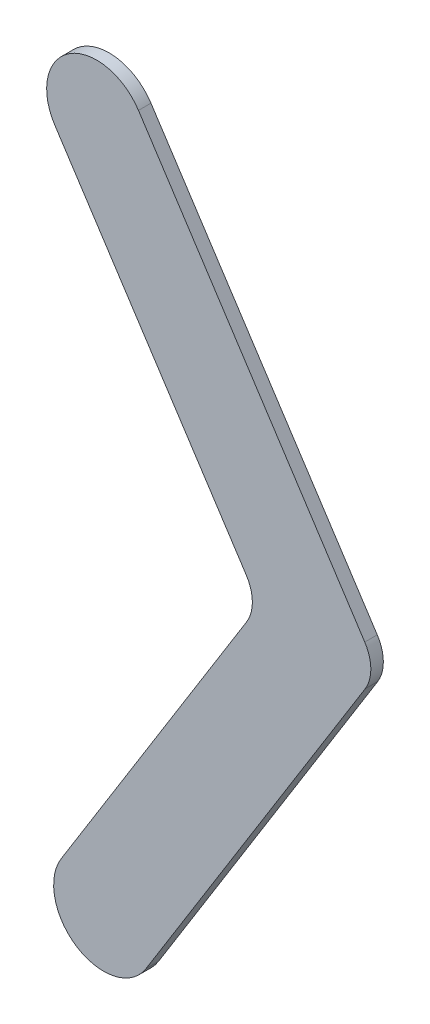
ISO-10303-21;
HEADER;
FILE_DESCRIPTION(('STEP AP214'),'2;1');
FILE_NAME('part.step','',(''),(''),'','','');
FILE_SCHEMA(('AUTOMOTIVE_DESIGN { 1 0 10303 214 1 1 1 1 }'));
ENDSEC;
DATA;
#1=APPLICATION_CONTEXT('core data for automotive mechanical design processes');
#2=APPLICATION_PROTOCOL_DEFINITION('international standard','automotive_design',2000,#1);
#3=PRODUCT_CONTEXT('',#1,'mechanical');
#4=PRODUCT('Part','Part','',(#3));
#5=PRODUCT_RELATED_PRODUCT_CATEGORY('part','',(#4));
#6=PRODUCT_DEFINITION_FORMATION('','',#4);
#7=PRODUCT_DEFINITION_CONTEXT('part definition',#1,'design');
#8=PRODUCT_DEFINITION('design','',#6,#7);
#9=PRODUCT_DEFINITION_SHAPE('','',#8);
#10=(LENGTH_UNIT() NAMED_UNIT(*) SI_UNIT(.MILLI.,.METRE.));
#11=(NAMED_UNIT(*) PLANE_ANGLE_UNIT() SI_UNIT($,.RADIAN.));
#12=(NAMED_UNIT(*) SI_UNIT($,.STERADIAN.) SOLID_ANGLE_UNIT());
#13=UNCERTAINTY_MEASURE_WITH_UNIT(LENGTH_MEASURE(1.E-05),#10,'distance_accuracy_value','');
#14=(GEOMETRIC_REPRESENTATION_CONTEXT(3) GLOBAL_UNCERTAINTY_ASSIGNED_CONTEXT((#13)) GLOBAL_UNIT_ASSIGNED_CONTEXT((#10,
#11,#12)) REPRESENTATION_CONTEXT('',''));
#15=CARTESIAN_POINT('',(0.,0.,0.));
#16=DIRECTION('',(0.,0.,1.));
#17=DIRECTION('',(1.,0.,0.));
#18=AXIS2_PLACEMENT_3D('',#15,#16,#17);
#19=CARTESIAN_POINT('',(0.,0.,1.));
#20=DIRECTION('',(0.837859454186145,0.545886009191384,0.));
#21=DIRECTION('',(-0.545886009191384,0.837859454186145,0.));
#22=AXIS2_PLACEMENT_3D('',#19,#20,#21);
#23=PLANE('',#22);
#24=DIRECTION('',(0.545886009191384,-0.837859454186145,0.));
#25=VECTOR('',#24,1.);
#26=CARTESIAN_POINT('',(0.,0.,0.));
#27=LINE('',#26,#25);
#28=CARTESIAN_POINT('',(-16.3765802757415,25.1357836255843,0.));
#29=VERTEX_POINT('',#28);
#30=CARTESIAN_POINT('',(-1.04330322674015,1.60132602299517,0.));
#31=VERTEX_POINT('',#30);
#32=EDGE_CURVE('E147',#29,#31,#27,.T.);
#33=ORIENTED_EDGE('',*,*,#32,.T.);
#34=DIRECTION('',(0.,0.,-1.));
#35=VECTOR('',#34,1.);
#36=CARTESIAN_POINT('',(-1.04330322674015,1.60132602299517,1.));
#37=LINE('',#36,#35);
#38=CARTESIAN_POINT('',(-1.04330322674015,1.60132602299517,1.));
#39=VERTEX_POINT('',#38);
#40=EDGE_CURVE('E65',#31,#39,#37,.F.);
#41=ORIENTED_EDGE('',*,*,#40,.T.);
#42=DIRECTION('',(0.545886009191384,-0.837859454186145,0.));
#43=VECTOR('',#42,1.);
#44=CARTESIAN_POINT('',(0.,0.,1.));
#45=LINE('',#44,#43);
#46=CARTESIAN_POINT('',(-16.3765802757415,25.1357836255843,1.));
#47=VERTEX_POINT('',#46);
#48=EDGE_CURVE('E117',#47,#39,#45,.T.);
#49=ORIENTED_EDGE('',*,*,#48,.F.);
#50=DIRECTION('',(0.,0.,-1.));
#51=VECTOR('',#50,1.);
#52=CARTESIAN_POINT('',(-16.3765802757415,25.1357836255843,1.));
#53=LINE('',#52,#51);
#54=EDGE_CURVE('E146',#47,#29,#53,.T.);
#55=ORIENTED_EDGE('',*,*,#54,.T.);
#56=EDGE_LOOP('',(#33,#41,#49,#55));
#57=FACE_BOUND('',#56,.T.);
#58=ADVANCED_FACE('F43',(#57),#23,.F.);
#59=CARTESIAN_POINT('',(0.,0.,1.));
#60=DIRECTION('',(0.848835447075673,-0.528657151458147,0.));
#61=DIRECTION('',(0.528657151458147,0.848835447075673,0.));
#62=AXIS2_PLACEMENT_3D('',#59,#60,#61);
#63=PLANE('',#62);
#64=DIRECTION('',(-0.528657151458147,-0.848835447075673,0.));
#65=VECTOR('',#64,1.);
#66=CARTESIAN_POINT('',(0.,0.,1.));
#67=LINE('',#66,#65);
#68=CARTESIAN_POINT('',(-1.01037524807156,-1.62230345895343,1.));
#69=VERTEX_POINT('',#68);
#70=CARTESIAN_POINT('',(-15.8597145437444,-25.4650634122702,1.));
#71=VERTEX_POINT('',#70);
#72=EDGE_CURVE('E106',#69,#71,#67,.T.);
#73=ORIENTED_EDGE('',*,*,#72,.F.);
#74=DIRECTION('',(0.,0.,-1.));
#75=VECTOR('',#74,1.);
#76=CARTESIAN_POINT('',(-1.01037524807156,-1.62230345895343,0.));
#77=LINE('',#76,#75);
#78=CARTESIAN_POINT('',(-1.01037524807156,-1.62230345895343,0.));
#79=VERTEX_POINT('',#78);
#80=EDGE_CURVE('E186',#69,#79,#77,.T.);
#81=ORIENTED_EDGE('',*,*,#80,.T.);
#82=DIRECTION('',(-0.528657151458147,-0.848835447075673,0.));
#83=VECTOR('',#82,1.);
#84=CARTESIAN_POINT('',(0.,0.,0.));
#85=LINE('',#84,#83);
#86=CARTESIAN_POINT('',(-15.8597145437444,-25.4650634122702,0.));
#87=VERTEX_POINT('',#86);
#88=EDGE_CURVE('E123',#79,#87,#85,.T.);
#89=ORIENTED_EDGE('',*,*,#88,.T.);
#90=DIRECTION('',(0.,0.,-1.));
#91=VECTOR('',#90,1.);
#92=CARTESIAN_POINT('',(-15.8597145437444,-25.4650634122702,1.));
#93=LINE('',#92,#91);
#94=EDGE_CURVE('E120',#71,#87,#93,.T.);
#95=ORIENTED_EDGE('',*,*,#94,.F.);
#96=EDGE_LOOP('',(#73,#81,#89,#95));
#97=FACE_BOUND('',#96,.T.);
#98=ADVANCED_FACE('F121',(#97),#63,.F.);
#99=CARTESIAN_POINT('',(-12.4643727554417,-27.5796920181028,1.));
#100=DIRECTION('',(0.,0.,-1.));
#101=DIRECTION('',(-1.,0.,0.));
#102=AXIS2_PLACEMENT_3D('',#99,#100,#101);
#103=CYLINDRICAL_SURFACE('',#102,4.);
#104=CARTESIAN_POINT('',(-12.4643727554417,-27.5796920181028,0.));
#105=DIRECTION('',(0.,0.,1.));
#106=DIRECTION('',(1.,0.,0.));
#107=AXIS2_PLACEMENT_3D('',#104,#105,#106);
#108=CIRCLE('',#107,4.);
#109=CARTESIAN_POINT('',(-9.06903096713901,-29.6943206239354,0.));
#110=VERTEX_POINT('',#109);
#111=EDGE_CURVE('E152',#87,#110,#108,.T.);
#112=ORIENTED_EDGE('',*,*,#111,.T.);
#113=DIRECTION('',(0.,0.,-1.));
#114=VECTOR('',#113,1.);
#115=CARTESIAN_POINT('',(-9.06903096713901,-29.6943206239354,1.));
#116=LINE('',#115,#114);
#117=CARTESIAN_POINT('',(-9.06903096713901,-29.6943206239354,1.));
#118=VERTEX_POINT('',#117);
#119=EDGE_CURVE('E128',#118,#110,#116,.T.);
#120=ORIENTED_EDGE('',*,*,#119,.F.);
#121=CARTESIAN_POINT('',(-12.4643727554417,-27.5796920181028,1.));
#122=DIRECTION('',(0.,0.,1.));
#123=DIRECTION('',(1.,0.,0.));
#124=AXIS2_PLACEMENT_3D('',#121,#122,#123);
#125=CIRCLE('',#124,4.);
#126=EDGE_CURVE('E111',#71,#118,#125,.T.);
#127=ORIENTED_EDGE('',*,*,#126,.F.);
#128=ORIENTED_EDGE('',*,*,#94,.T.);
#129=EDGE_LOOP('',(#112,#120,#127,#128));
#130=FACE_BOUND('',#129,.T.);
#131=ADVANCED_FACE('F130',(#130),#103,.T.);
#132=CARTESIAN_POINT('',(9.48501757146288,0.0968853455439621,1.));
#133=DIRECTION('',(-0.848835447075673,0.528657151458147,0.));
#134=DIRECTION('',(-0.528657151458147,-0.848835447075673,0.));
#135=AXIS2_PLACEMENT_3D('',#132,#133,#134);
#136=PLANE('',#135);
#137=DIRECTION('',(0.528657151458147,0.848835447075673,0.));
#138=VECTOR('',#137,1.);
#139=CARTESIAN_POINT('',(9.48501757146288,0.0968853455439621,0.));
#140=LINE('',#139,#138);
#141=CARTESIAN_POINT('',(8.47464232339132,-1.52541811340946,0.));
#142=VERTEX_POINT('',#141);
#143=EDGE_CURVE('E155',#110,#142,#140,.T.);
#144=ORIENTED_EDGE('',*,*,#143,.T.);
#145=DIRECTION('',(0.,0.,-1.));
#146=VECTOR('',#145,1.);
#147=CARTESIAN_POINT('',(8.47464232339132,-1.52541811340946,1.));
#148=LINE('',#147,#146);
#149=CARTESIAN_POINT('',(8.47464232339132,-1.52541811340946,1.));
#150=VERTEX_POINT('',#149);
#151=EDGE_CURVE('E180',#142,#150,#148,.F.);
#152=ORIENTED_EDGE('',*,*,#151,.T.);
#153=DIRECTION('',(0.528657151458147,0.848835447075673,0.));
#154=VECTOR('',#153,1.);
#155=CARTESIAN_POINT('',(9.48501757146288,0.0968853455439621,1.));
#156=LINE('',#155,#154);
#157=EDGE_CURVE('E134',#118,#150,#156,.T.);
#158=ORIENTED_EDGE('',*,*,#157,.F.);
#159=ORIENTED_EDGE('',*,*,#119,.T.);
#160=EDGE_LOOP('',(#144,#152,#158,#159));
#161=FACE_BOUND('',#160,.T.);
#162=ADVANCED_FACE('F213',(#161),#136,.F.);
#163=CARTESIAN_POINT('',(9.48501757146288,0.0968853455439621,1.));
#164=DIRECTION('',(-0.837859454186145,-0.545886009191384,0.));
#165=DIRECTION('',(0.545886009191384,-0.837859454186145,0.));
#166=AXIS2_PLACEMENT_3D('',#163,#164,#165);
#167=PLANE('',#166);
#168=DIRECTION('',(-0.545886009191384,0.837859454186144,0.));
#169=VECTOR('',#168,1.);
#170=CARTESIAN_POINT('',(9.48501757146288,0.0968853455439621,1.));
#171=LINE('',#170,#169);
#172=CARTESIAN_POINT('',(8.44171434472273,1.69821136853913,1.));
#173=VERTEX_POINT('',#172);
#174=CARTESIAN_POINT('',(-9.67370464225237,29.5028716991154,1.));
#175=VERTEX_POINT('',#174);
#176=EDGE_CURVE('E137',#173,#175,#171,.T.);
#177=ORIENTED_EDGE('',*,*,#176,.F.);
#178=DIRECTION('',(0.,0.,-1.));
#179=VECTOR('',#178,1.);
#180=CARTESIAN_POINT('',(8.44171434472273,1.69821136853913,1.));
#181=LINE('',#180,#179);
#182=CARTESIAN_POINT('',(8.44171434472273,1.69821136853913,0.));
#183=VERTEX_POINT('',#182);
#184=EDGE_CURVE('E127',#173,#183,#181,.T.);
#185=ORIENTED_EDGE('',*,*,#184,.T.);
#186=DIRECTION('',(-0.545886009191384,0.837859454186144,0.));
#187=VECTOR('',#186,1.);
#188=CARTESIAN_POINT('',(9.48501757146288,0.0968853455439621,0.));
#189=LINE('',#188,#187);
#190=CARTESIAN_POINT('',(-9.67370464225237,29.5028716991154,0.));
#191=VERTEX_POINT('',#190);
#192=EDGE_CURVE('E159',#183,#191,#189,.T.);
#193=ORIENTED_EDGE('',*,*,#192,.T.);
#194=DIRECTION('',(0.,0.,-1.));
#195=VECTOR('',#194,1.);
#196=CARTESIAN_POINT('',(-9.67370464225237,29.5028716991154,1.));
#197=LINE('',#196,#195);
#198=EDGE_CURVE('E168',#175,#191,#197,.T.);
#199=ORIENTED_EDGE('',*,*,#198,.F.);
#200=EDGE_LOOP('',(#177,#185,#193,#199));
#201=FACE_BOUND('',#200,.T.);
#202=ADVANCED_FACE('F216',(#201),#167,.F.);
#203=CARTESIAN_POINT('',(-13.0251424589969,27.3193276623499,1.));
#204=DIRECTION('',(0.,0.,-1.));
#205=DIRECTION('',(-1.,0.,0.));
#206=AXIS2_PLACEMENT_3D('',#203,#204,#205);
#207=CYLINDRICAL_SURFACE('',#206,4.);
#208=CARTESIAN_POINT('',(-13.0251424589969,27.3193276623499,0.));
#209=DIRECTION('',(0.,0.,1.));
#210=DIRECTION('',(-1.,0.,0.));
#211=AXIS2_PLACEMENT_3D('',#208,#209,#210);
#212=CIRCLE('',#211,4.);
#213=EDGE_CURVE('E162',#191,#29,#212,.T.);
#214=ORIENTED_EDGE('',*,*,#213,.T.);
#215=ORIENTED_EDGE('',*,*,#54,.F.);
#216=CARTESIAN_POINT('',(-13.0251424589969,27.3193276623499,1.));
#217=DIRECTION('',(0.,0.,1.));
#218=DIRECTION('',(-1.,0.,0.));
#219=AXIS2_PLACEMENT_3D('',#216,#217,#218);
#220=CIRCLE('',#219,4.);
#221=EDGE_CURVE('E143',#175,#47,#220,.T.);
#222=ORIENTED_EDGE('',*,*,#221,.F.);
#223=ORIENTED_EDGE('',*,*,#198,.T.);
#224=EDGE_LOOP('',(#214,#215,#222,#223));
#225=FACE_BOUND('',#224,.T.);
#226=ADVANCED_FACE('F220',(#225),#207,.T.);
#227=CARTESIAN_POINT('',(-13.0251424589969,27.3193276623499,1.));
#228=DIRECTION('',(0.,0.,-1.));
#229=DIRECTION('',(-1.,0.,0.));
#230=AXIS2_PLACEMENT_3D('',#227,#228,#229);
#231=PLANE('',#230);
#232=ORIENTED_EDGE('',*,*,#157,.T.);
#233=CARTESIAN_POINT('',(5.9281359821643,0.0605533409649764,1.));
#234=DIRECTION('',(0.,0.,-1.));
#235=DIRECTION('',(-1.,0.,0.));
#236=AXIS2_PLACEMENT_3D('',#233,#234,#235);
#237=CIRCLE('',#236,3.);
#238=EDGE_CURVE('E183',#150,#173,#237,.F.);
#239=ORIENTED_EDGE('',*,*,#238,.T.);
#240=ORIENTED_EDGE('',*,*,#176,.T.);
#241=ORIENTED_EDGE('',*,*,#221,.T.);
#242=ORIENTED_EDGE('',*,*,#48,.T.);
#243=CARTESIAN_POINT('',(-3.55688158929858,-0.0363320045789867,1.));
#244=DIRECTION('',(0.,0.,-1.));
#245=DIRECTION('',(-1.,0.,0.));
#246=AXIS2_PLACEMENT_3D('',#243,#244,#245);
#247=CIRCLE('',#246,3.);
#248=EDGE_CURVE('E11',#39,#69,#247,.T.);
#249=ORIENTED_EDGE('',*,*,#248,.T.);
#250=ORIENTED_EDGE('',*,*,#72,.T.);
#251=ORIENTED_EDGE('',*,*,#126,.T.);
#252=EDGE_LOOP('',(#232,#239,#240,#241,#242,#249,#250,#251));
#253=FACE_BOUND('',#252,.T.);
#254=ADVANCED_FACE('F109',(#253),#231,.F.);
#255=CARTESIAN_POINT('',(-13.0251424589969,27.3193276623499,0.));
#256=DIRECTION('',(0.,0.,-1.));
#257=DIRECTION('',(-1.,0.,0.));
#258=AXIS2_PLACEMENT_3D('',#255,#256,#257);
#259=PLANE('',#258);
#260=ORIENTED_EDGE('',*,*,#192,.F.);
#261=CARTESIAN_POINT('',(5.9281359821643,0.0605533409649764,0.));
#262=DIRECTION('',(0.,0.,-1.));
#263=DIRECTION('',(-1.,0.,0.));
#264=AXIS2_PLACEMENT_3D('',#261,#262,#263);
#265=CIRCLE('',#264,3.);
#266=EDGE_CURVE('E177',#183,#142,#265,.T.);
#267=ORIENTED_EDGE('',*,*,#266,.T.);
#268=ORIENTED_EDGE('',*,*,#143,.F.);
#269=ORIENTED_EDGE('',*,*,#111,.F.);
#270=ORIENTED_EDGE('',*,*,#88,.F.);
#271=CARTESIAN_POINT('',(-3.55688158929858,-0.0363320045789867,0.));
#272=DIRECTION('',(0.,0.,-1.));
#273=DIRECTION('',(-1.,0.,0.));
#274=AXIS2_PLACEMENT_3D('',#271,#272,#273);
#275=CIRCLE('',#274,3.);
#276=EDGE_CURVE('E52',#79,#31,#275,.F.);
#277=ORIENTED_EDGE('',*,*,#276,.T.);
#278=ORIENTED_EDGE('',*,*,#32,.F.);
#279=ORIENTED_EDGE('',*,*,#213,.F.);
#280=EDGE_LOOP('',(#260,#267,#268,#269,#270,#277,#278,#279));
#281=FACE_BOUND('',#280,.T.);
#282=ADVANCED_FACE('F194',(#281),#259,.T.);
#283=CARTESIAN_POINT('',(5.9281359821643,0.0605533409649764,1.));
#284=DIRECTION('',(0.,0.,-1.));
#285=DIRECTION('',(-1.,0.,0.));
#286=AXIS2_PLACEMENT_3D('',#283,#284,#285);
#287=CYLINDRICAL_SURFACE('',#286,3.);
#288=ORIENTED_EDGE('',*,*,#238,.F.);
#289=ORIENTED_EDGE('',*,*,#151,.F.);
#290=ORIENTED_EDGE('',*,*,#266,.F.);
#291=ORIENTED_EDGE('',*,*,#184,.F.);
#292=EDGE_LOOP('',(#288,#289,#290,#291));
#293=FACE_BOUND('',#292,.T.);
#294=ADVANCED_FACE('F199',(#293),#287,.T.);
#295=CARTESIAN_POINT('',(-3.55688158929858,-0.0363320045789867,1.));
#296=DIRECTION('',(0.,0.,1.));
#297=DIRECTION('',(1.,0.,0.));
#298=AXIS2_PLACEMENT_3D('',#295,#296,#297);
#299=CYLINDRICAL_SURFACE('',#298,3.);
#300=ORIENTED_EDGE('',*,*,#248,.F.);
#301=ORIENTED_EDGE('',*,*,#40,.F.);
#302=ORIENTED_EDGE('',*,*,#276,.F.);
#303=ORIENTED_EDGE('',*,*,#80,.F.);
#304=EDGE_LOOP('',(#300,#301,#302,#303));
#305=FACE_BOUND('',#304,.T.);
#306=ADVANCED_FACE('F45',(#305),#299,.F.);
#307=CLOSED_SHELL('',(#58,#98,#131,#162,#202,#226,#254,#282,#294,#306));
#308=MANIFOLD_SOLID_BREP('B2',#307);
#309=ADVANCED_BREP_SHAPE_REPRESENTATION('',(#18,#308),#14);
#310=SHAPE_DEFINITION_REPRESENTATION(#9,#309);
ENDSEC;
END-ISO-10303-21;
